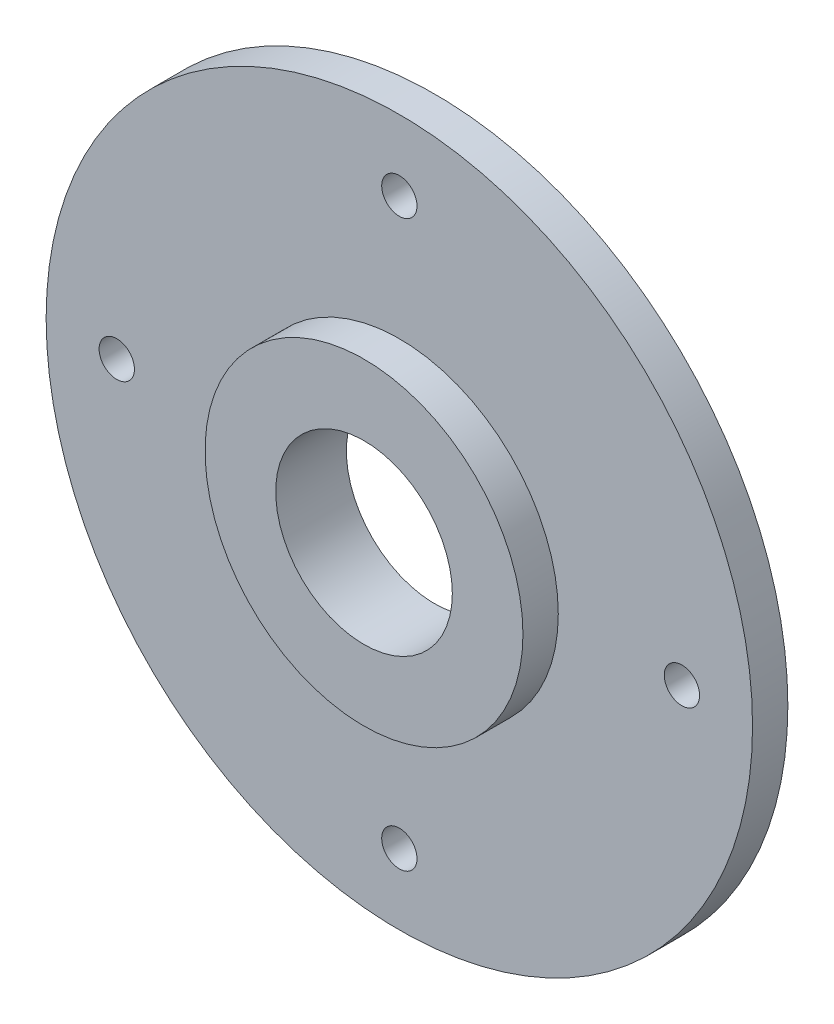
ISO-10303-21;
HEADER;
FILE_DESCRIPTION(('STEP AP214'),'2;1');
FILE_NAME('part.step','',(''),(''),'','','');
FILE_SCHEMA(('AUTOMOTIVE_DESIGN { 1 0 10303 214 1 1 1 1 }'));
ENDSEC;
DATA;
#1=APPLICATION_CONTEXT('core data for automotive mechanical design processes');
#2=APPLICATION_PROTOCOL_DEFINITION('international standard','automotive_design',2000,#1);
#3=PRODUCT_CONTEXT('',#1,'mechanical');
#4=PRODUCT('Part','Part','',(#3));
#5=PRODUCT_RELATED_PRODUCT_CATEGORY('part','',(#4));
#6=PRODUCT_DEFINITION_FORMATION('','',#4);
#7=PRODUCT_DEFINITION_CONTEXT('part definition',#1,'design');
#8=PRODUCT_DEFINITION('design','',#6,#7);
#9=PRODUCT_DEFINITION_SHAPE('','',#8);
#10=(LENGTH_UNIT() NAMED_UNIT(*) SI_UNIT(.MILLI.,.METRE.));
#11=(NAMED_UNIT(*) PLANE_ANGLE_UNIT() SI_UNIT($,.RADIAN.));
#12=(NAMED_UNIT(*) SI_UNIT($,.STERADIAN.) SOLID_ANGLE_UNIT());
#13=UNCERTAINTY_MEASURE_WITH_UNIT(LENGTH_MEASURE(1.E-05),#10,'distance_accuracy_value','');
#14=(GEOMETRIC_REPRESENTATION_CONTEXT(3) GLOBAL_UNCERTAINTY_ASSIGNED_CONTEXT((#13)) GLOBAL_UNIT_ASSIGNED_CONTEXT((#10,
#11,#12)) REPRESENTATION_CONTEXT('',''));
#15=CARTESIAN_POINT('',(0.,0.,0.));
#16=DIRECTION('',(0.,0.,1.));
#17=DIRECTION('',(1.,0.,0.));
#18=AXIS2_PLACEMENT_3D('',#15,#16,#17);
#19=CARTESIAN_POINT('',(0.,0.,1.));
#20=DIRECTION('',(0.,0.,-1.));
#21=DIRECTION('',(-1.,0.,0.));
#22=AXIS2_PLACEMENT_3D('',#19,#20,#21);
#23=CYLINDRICAL_SURFACE('',#22,10.);
#24=CARTESIAN_POINT('',(0.,0.,1.));
#25=DIRECTION('',(0.,0.,1.));
#26=DIRECTION('',(1.,0.,0.));
#27=AXIS2_PLACEMENT_3D('',#24,#25,#26);
#28=CIRCLE('',#27,10.);
#29=CARTESIAN_POINT('',(10.,0.,1.));
#30=VERTEX_POINT('',#29);
#31=EDGE_CURVE('E10',#30,#30,#28,.T.);
#32=ORIENTED_EDGE('',*,*,#31,.F.);
#33=EDGE_LOOP('',(#32));
#34=FACE_BOUND('',#33,.T.);
#35=CARTESIAN_POINT('',(0.,0.,0.));
#36=DIRECTION('',(0.,0.,1.));
#37=DIRECTION('',(1.,0.,0.));
#38=AXIS2_PLACEMENT_3D('',#35,#36,#37);
#39=CIRCLE('',#38,10.);
#40=CARTESIAN_POINT('',(10.,0.,0.));
#41=VERTEX_POINT('',#40);
#42=EDGE_CURVE('E35',#41,#41,#39,.T.);
#43=ORIENTED_EDGE('',*,*,#42,.T.);
#44=EDGE_LOOP('',(#43));
#45=FACE_BOUND('',#44,.T.);
#46=ADVANCED_FACE('F32',(#34,#45),#23,.T.);
#47=CARTESIAN_POINT('',(0.,0.,1.));
#48=DIRECTION('',(0.,0.,1.));
#49=DIRECTION('',(1.,0.,0.));
#50=AXIS2_PLACEMENT_3D('',#47,#48,#49);
#51=PLANE('',#50);
#52=CARTESIAN_POINT('',(-8.00000000000023,2.26393958003914E-13,1.));
#53=DIRECTION('',(0.,0.,1.));
#54=DIRECTION('',(1.,0.,0.));
#55=AXIS2_PLACEMENT_3D('',#52,#53,#54);
#56=CIRCLE('',#55,0.500000000000178);
#57=CARTESIAN_POINT('',(-7.50000000000005,2.26393958003914E-13,1.));
#58=VERTEX_POINT('',#57);
#59=EDGE_CURVE('E61',#58,#58,#56,.T.);
#60=ORIENTED_EDGE('',*,*,#59,.F.);
#61=EDGE_LOOP('',(#60));
#62=FACE_BOUND('',#61,.T.);
#63=CARTESIAN_POINT('',(-4.52787916007828E-13,-8.,1.));
#64=DIRECTION('',(0.,0.,1.));
#65=DIRECTION('',(1.,0.,0.));
#66=AXIS2_PLACEMENT_3D('',#63,#64,#65);
#67=CIRCLE('',#66,0.500000000000487);
#68=CARTESIAN_POINT('',(0.500000000000034,-8.,1.));
#69=VERTEX_POINT('',#68);
#70=EDGE_CURVE('E64',#69,#69,#67,.T.);
#71=ORIENTED_EDGE('',*,*,#70,.F.);
#72=EDGE_LOOP('',(#71));
#73=FACE_BOUND('',#72,.T.);
#74=CARTESIAN_POINT('',(7.99999999999977,-2.27373675443232E-13,1.));
#75=DIRECTION('',(0.,0.,1.));
#76=DIRECTION('',(1.,0.,0.));
#77=AXIS2_PLACEMENT_3D('',#74,#75,#76);
#78=CIRCLE('',#77,0.500000000000363);
#79=CARTESIAN_POINT('',(8.50000000000014,-2.27373675443232E-13,1.));
#80=VERTEX_POINT('',#79);
#81=EDGE_CURVE('E67',#80,#80,#78,.T.);
#82=ORIENTED_EDGE('',*,*,#81,.F.);
#83=EDGE_LOOP('',(#82));
#84=FACE_BOUND('',#83,.T.);
#85=CARTESIAN_POINT('',(0.,8.,1.));
#86=DIRECTION('',(0.,0.,1.));
#87=DIRECTION('',(1.,0.,0.));
#88=AXIS2_PLACEMENT_3D('',#85,#86,#87);
#89=CIRCLE('',#88,0.5);
#90=CARTESIAN_POINT('',(0.5,8.,1.));
#91=VERTEX_POINT('',#90);
#92=EDGE_CURVE('E53',#91,#91,#89,.T.);
#93=ORIENTED_EDGE('',*,*,#92,.F.);
#94=EDGE_LOOP('',(#93));
#95=FACE_BOUND('',#94,.T.);
#96=CARTESIAN_POINT('',(0.,0.,1.));
#97=DIRECTION('',(0.,0.,1.));
#98=DIRECTION('',(1.,0.,0.));
#99=AXIS2_PLACEMENT_3D('',#96,#97,#98);
#100=CIRCLE('',#99,4.5);
#101=CARTESIAN_POINT('',(4.5,0.,1.));
#102=VERTEX_POINT('',#101);
#103=EDGE_CURVE('E44',#102,#102,#100,.T.);
#104=ORIENTED_EDGE('',*,*,#103,.F.);
#105=EDGE_LOOP('',(#104));
#106=FACE_BOUND('',#105,.T.);
#107=ORIENTED_EDGE('',*,*,#31,.T.);
#108=EDGE_LOOP('',(#107));
#109=FACE_BOUND('',#108,.T.);
#110=ADVANCED_FACE('F86',(#62,#73,#84,#95,#106,#109),#51,.T.);
#111=CARTESIAN_POINT('',(0.,0.,0.));
#112=DIRECTION('',(0.,0.,1.));
#113=DIRECTION('',(1.,0.,0.));
#114=AXIS2_PLACEMENT_3D('',#111,#112,#113);
#115=PLANE('',#114);
#116=CARTESIAN_POINT('',(-8.00000000000023,2.26393958003914E-13,0.));
#117=DIRECTION('',(0.,0.,-1.));
#118=DIRECTION('',(-1.,0.,0.));
#119=AXIS2_PLACEMENT_3D('',#116,#117,#118);
#120=CIRCLE('',#119,0.500000000000178);
#121=CARTESIAN_POINT('',(-8.5000000000004,2.26393958003914E-13,0.));
#122=VERTEX_POINT('',#121);
#123=EDGE_CURVE('E70',#122,#122,#120,.T.);
#124=ORIENTED_EDGE('',*,*,#123,.F.);
#125=EDGE_LOOP('',(#124));
#126=FACE_BOUND('',#125,.T.);
#127=CARTESIAN_POINT('',(-4.52787916007828E-13,-8.,0.));
#128=DIRECTION('',(0.,0.,-1.));
#129=DIRECTION('',(-1.,0.,0.));
#130=AXIS2_PLACEMENT_3D('',#127,#128,#129);
#131=CIRCLE('',#130,0.500000000000487);
#132=CARTESIAN_POINT('',(-0.500000000000939,-8.,0.));
#133=VERTEX_POINT('',#132);
#134=EDGE_CURVE('E74',#133,#133,#131,.T.);
#135=ORIENTED_EDGE('',*,*,#134,.F.);
#136=EDGE_LOOP('',(#135));
#137=FACE_BOUND('',#136,.T.);
#138=CARTESIAN_POINT('',(7.99999999999977,-2.27373675443232E-13,0.));
#139=DIRECTION('',(0.,0.,-1.));
#140=DIRECTION('',(-1.,0.,0.));
#141=AXIS2_PLACEMENT_3D('',#138,#139,#140);
#142=CIRCLE('',#141,0.500000000000363);
#143=CARTESIAN_POINT('',(7.49999999999941,-2.27373675443232E-13,0.));
#144=VERTEX_POINT('',#143);
#145=EDGE_CURVE('E71',#144,#144,#142,.T.);
#146=ORIENTED_EDGE('',*,*,#145,.F.);
#147=EDGE_LOOP('',(#146));
#148=FACE_BOUND('',#147,.T.);
#149=CARTESIAN_POINT('',(0.,8.,0.));
#150=DIRECTION('',(0.,0.,-1.));
#151=DIRECTION('',(-1.,0.,0.));
#152=AXIS2_PLACEMENT_3D('',#149,#150,#151);
#153=CIRCLE('',#152,0.5);
#154=CARTESIAN_POINT('',(-0.5,8.,0.));
#155=VERTEX_POINT('',#154);
#156=EDGE_CURVE('E58',#155,#155,#153,.T.);
#157=ORIENTED_EDGE('',*,*,#156,.F.);
#158=EDGE_LOOP('',(#157));
#159=FACE_BOUND('',#158,.T.);
#160=CARTESIAN_POINT('',(0.,0.,0.));
#161=DIRECTION('',(0.,0.,1.));
#162=DIRECTION('',(1.,0.,0.));
#163=AXIS2_PLACEMENT_3D('',#160,#161,#162);
#164=CIRCLE('',#163,2.5);
#165=CARTESIAN_POINT('',(2.5,0.,0.));
#166=VERTEX_POINT('',#165);
#167=EDGE_CURVE('E47',#166,#166,#164,.T.);
#168=ORIENTED_EDGE('',*,*,#167,.T.);
#169=EDGE_LOOP('',(#168));
#170=FACE_BOUND('',#169,.T.);
#171=ORIENTED_EDGE('',*,*,#42,.F.);
#172=EDGE_LOOP('',(#171));
#173=FACE_BOUND('',#172,.T.);
#174=ADVANCED_FACE('F82',(#126,#137,#148,#159,#170,#173),#115,.F.);
#175=CARTESIAN_POINT('',(0.,0.,2.));
#176=DIRECTION('',(0.,0.,-1.));
#177=DIRECTION('',(-1.,0.,0.));
#178=AXIS2_PLACEMENT_3D('',#175,#176,#177);
#179=CYLINDRICAL_SURFACE('',#178,4.5);
#180=CARTESIAN_POINT('',(0.,0.,2.));
#181=DIRECTION('',(0.,0.,1.));
#182=DIRECTION('',(1.,0.,0.));
#183=AXIS2_PLACEMENT_3D('',#180,#181,#182);
#184=CIRCLE('',#183,4.5);
#185=CARTESIAN_POINT('',(4.5,0.,2.));
#186=VERTEX_POINT('',#185);
#187=EDGE_CURVE('E42',#186,#186,#184,.T.);
#188=ORIENTED_EDGE('',*,*,#187,.F.);
#189=EDGE_LOOP('',(#188));
#190=FACE_BOUND('',#189,.T.);
#191=ORIENTED_EDGE('',*,*,#103,.T.);
#192=EDGE_LOOP('',(#191));
#193=FACE_BOUND('',#192,.T.);
#194=ADVANCED_FACE('F85',(#190,#193),#179,.T.);
#195=CARTESIAN_POINT('',(0.,0.,2.));
#196=DIRECTION('',(0.,0.,1.));
#197=DIRECTION('',(1.,0.,0.));
#198=AXIS2_PLACEMENT_3D('',#195,#196,#197);
#199=PLANE('',#198);
#200=CARTESIAN_POINT('',(0.,0.,2.));
#201=DIRECTION('',(0.,0.,1.));
#202=DIRECTION('',(1.,0.,0.));
#203=AXIS2_PLACEMENT_3D('',#200,#201,#202);
#204=CIRCLE('',#203,2.5);
#205=CARTESIAN_POINT('',(2.5,0.,2.));
#206=VERTEX_POINT('',#205);
#207=EDGE_CURVE('E50',#206,#206,#204,.T.);
#208=ORIENTED_EDGE('',*,*,#207,.F.);
#209=EDGE_LOOP('',(#208));
#210=FACE_BOUND('',#209,.T.);
#211=ORIENTED_EDGE('',*,*,#187,.T.);
#212=EDGE_LOOP('',(#211));
#213=FACE_BOUND('',#212,.T.);
#214=ADVANCED_FACE('F111',(#210,#213),#199,.T.);
#215=CARTESIAN_POINT('',(0.,0.,0.));
#216=DIRECTION('',(0.,0.,1.));
#217=DIRECTION('',(1.,0.,0.));
#218=AXIS2_PLACEMENT_3D('',#215,#216,#217);
#219=CYLINDRICAL_SURFACE('',#218,2.5);
#220=ORIENTED_EDGE('',*,*,#167,.F.);
#221=EDGE_LOOP('',(#220));
#222=FACE_BOUND('',#221,.T.);
#223=ORIENTED_EDGE('',*,*,#207,.T.);
#224=EDGE_LOOP('',(#223));
#225=FACE_BOUND('',#224,.T.);
#226=ADVANCED_FACE('F115',(#222,#225),#219,.F.);
#227=CARTESIAN_POINT('',(0.,8.,2.));
#228=DIRECTION('',(0.,0.,-1.));
#229=DIRECTION('',(-1.,0.,0.));
#230=AXIS2_PLACEMENT_3D('',#227,#228,#229);
#231=CYLINDRICAL_SURFACE('',#230,0.5);
#232=ORIENTED_EDGE('',*,*,#92,.T.);
#233=EDGE_LOOP('',(#232));
#234=FACE_BOUND('',#233,.T.);
#235=ORIENTED_EDGE('',*,*,#156,.T.);
#236=EDGE_LOOP('',(#235));
#237=FACE_BOUND('',#236,.T.);
#238=ADVANCED_FACE('F119',(#234,#237),#231,.F.);
#239=CARTESIAN_POINT('',(7.99999999999977,-2.27373675443232E-13,2.));
#240=DIRECTION('',(0.,0.,-1.));
#241=DIRECTION('',(-1.,0.,0.));
#242=AXIS2_PLACEMENT_3D('',#239,#240,#241);
#243=CYLINDRICAL_SURFACE('',#242,0.500000000000363);
#244=ORIENTED_EDGE('',*,*,#81,.T.);
#245=EDGE_LOOP('',(#244));
#246=FACE_BOUND('',#245,.T.);
#247=ORIENTED_EDGE('',*,*,#145,.T.);
#248=EDGE_LOOP('',(#247));
#249=FACE_BOUND('',#248,.T.);
#250=ADVANCED_FACE('F123',(#246,#249),#243,.F.);
#251=CARTESIAN_POINT('',(-4.52787916007828E-13,-8.,2.));
#252=DIRECTION('',(0.,0.,-1.));
#253=DIRECTION('',(-1.,0.,0.));
#254=AXIS2_PLACEMENT_3D('',#251,#252,#253);
#255=CYLINDRICAL_SURFACE('',#254,0.500000000000487);
#256=ORIENTED_EDGE('',*,*,#70,.T.);
#257=EDGE_LOOP('',(#256));
#258=FACE_BOUND('',#257,.T.);
#259=ORIENTED_EDGE('',*,*,#134,.T.);
#260=EDGE_LOOP('',(#259));
#261=FACE_BOUND('',#260,.T.);
#262=ADVANCED_FACE('F127',(#258,#261),#255,.F.);
#263=CARTESIAN_POINT('',(-8.00000000000023,2.26393958003914E-13,2.));
#264=DIRECTION('',(0.,0.,-1.));
#265=DIRECTION('',(-1.,0.,0.));
#266=AXIS2_PLACEMENT_3D('',#263,#264,#265);
#267=CYLINDRICAL_SURFACE('',#266,0.500000000000178);
#268=ORIENTED_EDGE('',*,*,#59,.T.);
#269=EDGE_LOOP('',(#268));
#270=FACE_BOUND('',#269,.T.);
#271=ORIENTED_EDGE('',*,*,#123,.T.);
#272=EDGE_LOOP('',(#271));
#273=FACE_BOUND('',#272,.T.);
#274=ADVANCED_FACE('F80',(#270,#273),#267,.F.);
#275=CLOSED_SHELL('',(#46,#110,#174,#194,#214,#226,#238,#250,#262,#274));
#276=MANIFOLD_SOLID_BREP('B2',#275);
#277=ADVANCED_BREP_SHAPE_REPRESENTATION('',(#18,#276),#14);
#278=SHAPE_DEFINITION_REPRESENTATION(#9,#277);
ENDSEC;
END-ISO-10303-21;
